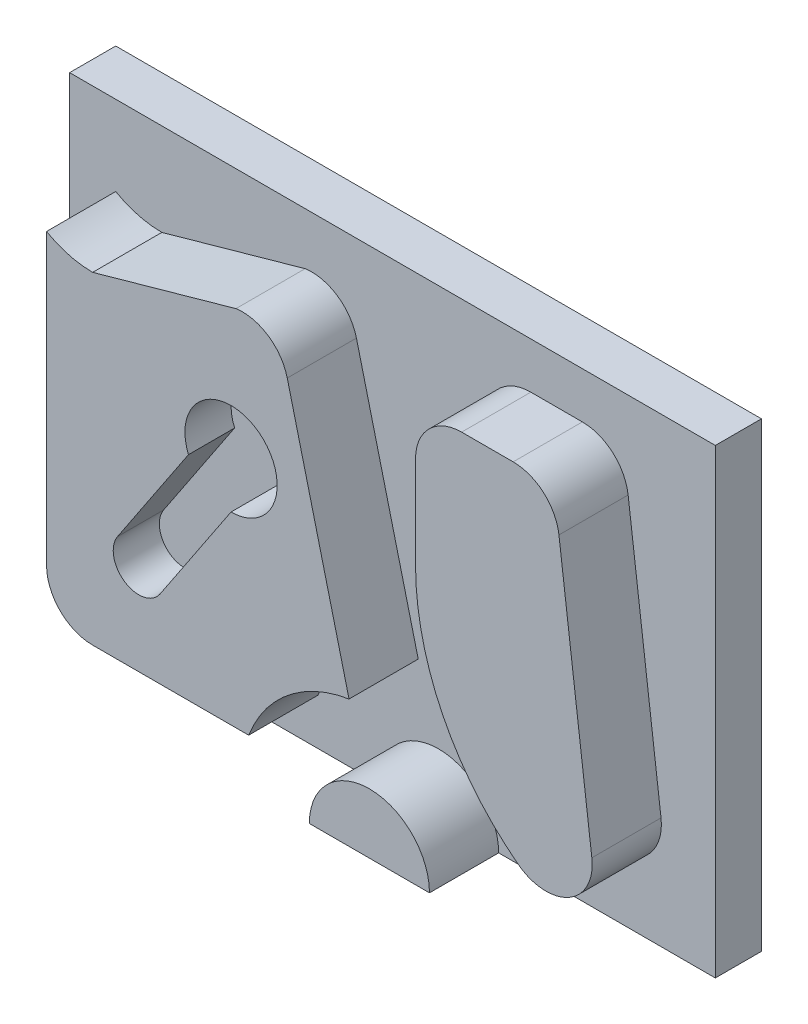
ISO-10303-21;
HEADER;
FILE_DESCRIPTION(('STEP AP214'),'2;1');
FILE_NAME('part.step','',(''),(''),'','','');
FILE_SCHEMA(('AUTOMOTIVE_DESIGN { 1 0 10303 214 1 1 1 1 }'));
ENDSEC;
DATA;
#1=APPLICATION_CONTEXT('core data for automotive mechanical design processes');
#2=APPLICATION_PROTOCOL_DEFINITION('international standard','automotive_design',2000,#1);
#3=PRODUCT_CONTEXT('',#1,'mechanical');
#4=PRODUCT('Part','Part','',(#3));
#5=PRODUCT_RELATED_PRODUCT_CATEGORY('part','',(#4));
#6=PRODUCT_DEFINITION_FORMATION('','',#4);
#7=PRODUCT_DEFINITION_CONTEXT('part definition',#1,'design');
#8=PRODUCT_DEFINITION('design','',#6,#7);
#9=PRODUCT_DEFINITION_SHAPE('','',#8);
#10=(LENGTH_UNIT() NAMED_UNIT(*) SI_UNIT(.MILLI.,.METRE.));
#11=(NAMED_UNIT(*) PLANE_ANGLE_UNIT() SI_UNIT($,.RADIAN.));
#12=(NAMED_UNIT(*) SI_UNIT($,.STERADIAN.) SOLID_ANGLE_UNIT());
#13=UNCERTAINTY_MEASURE_WITH_UNIT(LENGTH_MEASURE(1.E-05),#10,'distance_accuracy_value','');
#14=(GEOMETRIC_REPRESENTATION_CONTEXT(3) GLOBAL_UNCERTAINTY_ASSIGNED_CONTEXT((#13)) GLOBAL_UNIT_ASSIGNED_CONTEXT((#10,
#11,#12)) REPRESENTATION_CONTEXT('',''));
#15=CARTESIAN_POINT('',(0.,0.,0.));
#16=DIRECTION('',(0.,0.,1.));
#17=DIRECTION('',(1.,0.,0.));
#18=AXIS2_PLACEMENT_3D('',#15,#16,#17);
#19=CARTESIAN_POINT('',(170.,30.,12.5));
#20=DIRECTION('',(0.,0.,-1.));
#21=DIRECTION('',(-1.,0.,0.));
#22=AXIS2_PLACEMENT_3D('',#19,#20,#21);
#23=CYLINDRICAL_SURFACE('',#22,10.);
#24=CARTESIAN_POINT('',(170.,30.,10.));
#25=DIRECTION('',(0.,0.,-1.));
#26=DIRECTION('',(1.,0.,0.));
#27=AXIS2_PLACEMENT_3D('',#24,#25,#26);
#28=CIRCLE('',#27,10.);
#29=CARTESIAN_POINT('',(160.,30.,10.));
#30=VERTEX_POINT('',#29);
#31=CARTESIAN_POINT('',(170.,40.,10.));
#32=VERTEX_POINT('',#31);
#33=EDGE_CURVE('E260',#30,#32,#28,.T.);
#34=ORIENTED_EDGE('',*,*,#33,.F.);
#35=DIRECTION('',(0.,0.,1.));
#36=VECTOR('',#35,1.);
#37=CARTESIAN_POINT('',(160.,30.,12.5));
#38=LINE('',#37,#36);
#39=CARTESIAN_POINT('',(160.,30.,25.));
#40=VERTEX_POINT('',#39);
#41=EDGE_CURVE('E59',#30,#40,#38,.T.);
#42=ORIENTED_EDGE('',*,*,#41,.T.);
#43=CARTESIAN_POINT('',(170.,30.,25.));
#44=DIRECTION('',(0.,0.,1.));
#45=DIRECTION('',(-1.,0.,0.));
#46=AXIS2_PLACEMENT_3D('',#43,#44,#45);
#47=CIRCLE('',#46,10.);
#48=CARTESIAN_POINT('',(170.,40.,25.));
#49=VERTEX_POINT('',#48);
#50=EDGE_CURVE('E259',#49,#40,#47,.T.);
#51=ORIENTED_EDGE('',*,*,#50,.F.);
#52=DIRECTION('',(0.,0.,1.));
#53=VECTOR('',#52,1.);
#54=CARTESIAN_POINT('',(170.,40.,12.5));
#55=LINE('',#54,#53);
#56=EDGE_CURVE('E11',#32,#49,#55,.T.);
#57=ORIENTED_EDGE('',*,*,#56,.F.);
#58=EDGE_LOOP('',(#34,#42,#51,#57));
#59=FACE_BOUND('',#58,.T.);
#60=ADVANCED_FACE('F51',(#59),#23,.T.);
#61=CARTESIAN_POINT('',(190.,40.,10.));
#62=DIRECTION('',(0.,1.,0.));
#63=DIRECTION('',(1.,0.,0.));
#64=AXIS2_PLACEMENT_3D('',#61,#62,#63);
#65=PLANE('',#64);
#66=ORIENTED_EDGE('',*,*,#56,.T.);
#67=DIRECTION('',(-1.,0.,0.));
#68=VECTOR('',#67,1.);
#69=CARTESIAN_POINT('',(170.,40.,25.));
#70=LINE('',#69,#68);
#71=CARTESIAN_POINT('',(181.172177815,40.,25.));
#72=VERTEX_POINT('',#71);
#73=EDGE_CURVE('E278',#72,#49,#70,.T.);
#74=ORIENTED_EDGE('',*,*,#73,.F.);
#75=DIRECTION('',(0.,0.,-1.));
#76=VECTOR('',#75,1.);
#77=CARTESIAN_POINT('',(181.172177815,40.,12.5));
#78=LINE('',#77,#76);
#79=CARTESIAN_POINT('',(181.172177815,40.,10.));
#80=VERTEX_POINT('',#79);
#81=EDGE_CURVE('E522',#72,#80,#78,.T.);
#82=ORIENTED_EDGE('',*,*,#81,.T.);
#83=DIRECTION('',(1.,0.,0.));
#84=VECTOR('',#83,1.);
#85=CARTESIAN_POINT('',(175.586088907,40.,10.));
#86=LINE('',#85,#84);
#87=EDGE_CURVE('E526',#32,#80,#86,.T.);
#88=ORIENTED_EDGE('',*,*,#87,.F.);
#89=EDGE_LOOP('',(#66,#74,#82,#88));
#90=FACE_BOUND('',#89,.T.);
#91=ADVANCED_FACE('F539',(#90),#65,.T.);
#92=CARTESIAN_POINT('',(160.,40.,10.));
#93=DIRECTION('',(-1.,0.,0.));
#94=DIRECTION('',(0.,0.,1.));
#95=AXIS2_PLACEMENT_3D('',#92,#93,#94);
#96=PLANE('',#95);
#97=DIRECTION('',(0.,1.,0.));
#98=VECTOR('',#97,1.);
#99=CARTESIAN_POINT('',(160.,20.,10.));
#100=LINE('',#99,#98);
#101=CARTESIAN_POINT('',(160.,10.,10.));
#102=VERTEX_POINT('',#101);
#103=EDGE_CURVE('E529',#102,#30,#100,.T.);
#104=ORIENTED_EDGE('',*,*,#103,.F.);
#105=DIRECTION('',(0.,0.,1.));
#106=VECTOR('',#105,1.);
#107=CARTESIAN_POINT('',(160.,10.,17.5));
#108=LINE('',#107,#106);
#109=CARTESIAN_POINT('',(160.,10.,25.));
#110=VERTEX_POINT('',#109);
#111=EDGE_CURVE('E267',#102,#110,#108,.T.);
#112=ORIENTED_EDGE('',*,*,#111,.T.);
#113=DIRECTION('',(0.,-1.,0.));
#114=VECTOR('',#113,1.);
#115=CARTESIAN_POINT('',(160.,30.,25.));
#116=LINE('',#115,#114);
#117=EDGE_CURVE('E264',#40,#110,#116,.T.);
#118=ORIENTED_EDGE('',*,*,#117,.F.);
#119=ORIENTED_EDGE('',*,*,#41,.F.);
#120=EDGE_LOOP('',(#104,#112,#118,#119));
#121=FACE_BOUND('',#120,.T.);
#122=ADVANCED_FACE('F265',(#121),#96,.T.);
#123=CARTESIAN_POINT('',(140.,0.,10.));
#124=DIRECTION('',(0.,0.,-1.));
#125=DIRECTION('',(0.,-1.,0.));
#126=AXIS2_PLACEMENT_3D('',#123,#124,#125);
#127=PLANE('',#126);
#128=DIRECTION('',(0.,1.,0.));
#129=VECTOR('',#128,1.);
#130=CARTESIAN_POINT('',(80.,1.33974596216,10.));
#131=LINE('',#130,#129);
#132=CARTESIAN_POINT('',(80.,-30.,10.));
#133=VERTEX_POINT('',#132);
#134=CARTESIAN_POINT('',(80.,32.6794919243,10.));
#135=VERTEX_POINT('',#134);
#136=EDGE_CURVE('E352',#133,#135,#131,.T.);
#137=ORIENTED_EDGE('',*,*,#136,.T.);
#138=CARTESIAN_POINT('',(90.,50.,10.));
#139=DIRECTION('',(0.,0.,1.));
#140=DIRECTION('',(1.,0.,0.));
#141=AXIS2_PLACEMENT_3D('',#138,#139,#140);
#142=CIRCLE('',#141,20.);
#143=CARTESIAN_POINT('',(90.,30.,10.));
#144=VERTEX_POINT('',#143);
#145=EDGE_CURVE('E321',#135,#144,#142,.T.);
#146=ORIENTED_EDGE('',*,*,#145,.T.);
#147=DIRECTION('',(0.962767107405164,0.270332197303046,0.));
#148=VECTOR('',#147,1.);
#149=CARTESIAN_POINT('',(105.53588088,34.3622686971,10.));
#150=LINE('',#149,#148);
#151=CARTESIAN_POINT('',(121.071761759,38.7245373942,10.));
#152=VERTEX_POINT('',#151);
#153=EDGE_CURVE('E356',#144,#152,#150,.T.);
#154=ORIENTED_EDGE('',*,*,#153,.T.);
#155=CARTESIAN_POINT('',(122.485975322,28.8250424576,10.));
#156=DIRECTION('',(0.,0.,-1.));
#157=DIRECTION('',(1.,0.,0.));
#158=AXIS2_PLACEMENT_3D('',#155,#156,#157);
#159=CIRCLE('',#158,10.);
#160=CARTESIAN_POINT('',(132.187400323,31.2503987079,10.));
#161=VERTEX_POINT('',#160);
#162=EDGE_CURVE('E313',#152,#161,#159,.T.);
#163=ORIENTED_EDGE('',*,*,#162,.T.);
#164=DIRECTION('',(0.242535625036098,-0.970142500145391,0.));
#165=VECTOR('',#164,1.);
#166=CARTESIAN_POINT('',(138.884493286,4.46202685544,10.));
#167=LINE('',#166,#165);
#168=CARTESIAN_POINT('',(145.581586249,-22.3263449971,10.));
#169=VERTEX_POINT('',#168);
#170=EDGE_CURVE('E307',#161,#169,#167,.T.);
#171=ORIENTED_EDGE('',*,*,#170,.T.);
#172=CARTESIAN_POINT('',(150.,-50.,10.));
#173=DIRECTION('',(0.,0.,1.));
#174=DIRECTION('',(1.,0.,0.));
#175=AXIS2_PLACEMENT_3D('',#172,#173,#174);
#176=CIRCLE('',#175,28.0241603138);
#177=CARTESIAN_POINT('',(123.820741773,-40.,10.));
#178=VERTEX_POINT('',#177);
#179=EDGE_CURVE('E401',#169,#178,#176,.T.);
#180=ORIENTED_EDGE('',*,*,#179,.T.);
#181=DIRECTION('',(-1.,0.,0.));
#182=VECTOR('',#181,1.);
#183=CARTESIAN_POINT('',(106.910370887,-40.,10.));
#184=LINE('',#183,#182);
#185=CARTESIAN_POINT('',(90.,-40.,10.));
#186=VERTEX_POINT('',#185);
#187=EDGE_CURVE('E415',#178,#186,#184,.T.);
#188=ORIENTED_EDGE('',*,*,#187,.T.);
#189=CARTESIAN_POINT('',(90.,-30.,10.));
#190=DIRECTION('',(0.,0.,-1.));
#191=DIRECTION('',(1.,0.,0.));
#192=AXIS2_PLACEMENT_3D('',#189,#190,#191);
#193=CIRCLE('',#192,10.);
#194=EDGE_CURVE('E422',#186,#133,#193,.T.);
#195=ORIENTED_EDGE('',*,*,#194,.T.);
#196=EDGE_LOOP('',(#137,#146,#154,#163,#171,#180,#188,#195));
#197=FACE_BOUND('',#196,.T.);
#198=ORIENTED_EDGE('',*,*,#87,.T.);
#199=CARTESIAN_POINT('',(181.172177815,30.,10.));
#200=DIRECTION('',(0.,0.,-1.));
#201=DIRECTION('',(1.,0.,0.));
#202=AXIS2_PLACEMENT_3D('',#199,#200,#201);
#203=CIRCLE('',#202,10.);
#204=CARTESIAN_POINT('',(191.094956582,31.2403473459,10.));
#205=VERTEX_POINT('',#204);
#206=EDGE_CURVE('E519',#80,#205,#203,.T.);
#207=ORIENTED_EDGE('',*,*,#206,.T.);
#208=DIRECTION('',(0.124034734588962,-0.992277876713698,0.));
#209=VECTOR('',#208,1.);
#210=CARTESIAN_POINT('',(194.661142958,2.71085633757,10.));
#211=LINE('',#210,#209);
#212=CARTESIAN_POINT('',(198.227329334,-25.8186346708,10.));
#213=VERTEX_POINT('',#212);
#214=EDGE_CURVE('E512',#205,#213,#211,.T.);
#215=ORIENTED_EDGE('',*,*,#214,.T.);
#216=CARTESIAN_POINT('',(188.304550567,-27.0589820166,10.));
#217=DIRECTION('',(0.,0.,-1.));
#218=DIRECTION('',(1.,0.,0.));
#219=AXIS2_PLACEMENT_3D('',#216,#217,#218);
#220=CIRCLE('',#219,10.);
#221=CARTESIAN_POINT('',(182.22695426,-35.0001924488,10.));
#222=VERTEX_POINT('',#221);
#223=EDGE_CURVE('E506',#213,#222,#220,.T.);
#224=ORIENTED_EDGE('',*,*,#223,.T.);
#225=CARTESIAN_POINT('',(216.666666667,10.,10.));
#226=DIRECTION('',(0.,0.,-1.));
#227=DIRECTION('',(1.,0.,0.));
#228=AXIS2_PLACEMENT_3D('',#225,#226,#227);
#229=CIRCLE('',#228,56.6666666667);
#230=EDGE_CURVE('E502',#222,#102,#229,.T.);
#231=ORIENTED_EDGE('',*,*,#230,.T.);
#232=ORIENTED_EDGE('',*,*,#103,.T.);
#233=ORIENTED_EDGE('',*,*,#33,.T.);
#234=EDGE_LOOP('',(#198,#207,#215,#224,#231,#232,#233));
#235=FACE_BOUND('',#234,.T.);
#236=CARTESIAN_POINT('',(150.,-50.,10.));
#237=DIRECTION('',(0.,0.,-1.));
#238=DIRECTION('',(1.,0.,0.));
#239=AXIS2_PLACEMENT_3D('',#236,#237,#238);
#240=CIRCLE('',#239,13.0241603138);
#241=CARTESIAN_POINT('',(136.975839686,-50.,10.));
#242=VERTEX_POINT('',#241);
#243=CARTESIAN_POINT('',(163.024160314,-50.,10.));
#244=VERTEX_POINT('',#243);
#245=EDGE_CURVE('E433',#242,#244,#240,.T.);
#246=ORIENTED_EDGE('',*,*,#245,.T.);
#247=DIRECTION('',(-1.,0.,0.));
#248=VECTOR('',#247,1.);
#249=CARTESIAN_POINT('',(186.512080157,-50.,10.));
#250=LINE('',#249,#248);
#251=CARTESIAN_POINT('',(210.,-50.,10.));
#252=VERTEX_POINT('',#251);
#253=EDGE_CURVE('E437',#252,#244,#250,.T.);
#254=ORIENTED_EDGE('',*,*,#253,.F.);
#255=DIRECTION('',(0.,-1.,0.));
#256=VECTOR('',#255,1.);
#257=CARTESIAN_POINT('',(210.,0.,10.));
#258=LINE('',#257,#256);
#259=CARTESIAN_POINT('',(210.,50.,10.));
#260=VERTEX_POINT('',#259);
#261=EDGE_CURVE('E347',#260,#252,#258,.T.);
#262=ORIENTED_EDGE('',*,*,#261,.F.);
#263=DIRECTION('',(1.,0.,0.));
#264=VECTOR('',#263,1.);
#265=CARTESIAN_POINT('',(140.,50.,10.));
#266=LINE('',#265,#264);
#267=CARTESIAN_POINT('',(70.,50.,10.));
#268=VERTEX_POINT('',#267);
#269=EDGE_CURVE('E458',#268,#260,#266,.T.);
#270=ORIENTED_EDGE('',*,*,#269,.F.);
#271=DIRECTION('',(0.,1.,0.));
#272=VECTOR('',#271,1.);
#273=CARTESIAN_POINT('',(70.,0.,10.));
#274=LINE('',#273,#272);
#275=CARTESIAN_POINT('',(70.,-50.,10.));
#276=VERTEX_POINT('',#275);
#277=EDGE_CURVE('E468',#276,#268,#274,.T.);
#278=ORIENTED_EDGE('',*,*,#277,.F.);
#279=DIRECTION('',(-1.,0.,0.));
#280=VECTOR('',#279,1.);
#281=CARTESIAN_POINT('',(103.487919843,-50.,10.));
#282=LINE('',#281,#280);
#283=EDGE_CURVE('E387',#242,#276,#282,.T.);
#284=ORIENTED_EDGE('',*,*,#283,.F.);
#285=EDGE_LOOP('',(#246,#254,#262,#270,#278,#284));
#286=FACE_BOUND('',#285,.T.);
#287=ADVANCED_FACE('F536',(#197,#235,#286),#127,.F.);
#288=CARTESIAN_POINT('',(181.172177815,30.,12.5));
#289=DIRECTION('',(0.,0.,-1.));
#290=DIRECTION('',(0.,1.,0.));
#291=AXIS2_PLACEMENT_3D('',#288,#289,#290);
#292=CYLINDRICAL_SURFACE('',#291,10.);
#293=ORIENTED_EDGE('',*,*,#206,.F.);
#294=ORIENTED_EDGE('',*,*,#81,.F.);
#295=CARTESIAN_POINT('',(181.172177815,30.0000000001537,25.));
#296=DIRECTION('',(0.,0.,1.));
#297=DIRECTION('',(-1.,0.,0.));
#298=AXIS2_PLACEMENT_3D('',#295,#296,#297);
#299=CIRCLE('',#298,9.99999999984628);
#300=CARTESIAN_POINT('',(191.094956582,31.2403473459,25.));
#301=VERTEX_POINT('',#300);
#302=EDGE_CURVE('E292',#301,#72,#299,.T.);
#303=ORIENTED_EDGE('',*,*,#302,.F.);
#304=DIRECTION('',(0.,0.,-1.));
#305=VECTOR('',#304,1.);
#306=CARTESIAN_POINT('',(191.094956582,31.2403473459,12.5));
#307=LINE('',#306,#305);
#308=EDGE_CURVE('E515',#301,#205,#307,.T.);
#309=ORIENTED_EDGE('',*,*,#308,.T.);
#310=EDGE_LOOP('',(#293,#294,#303,#309));
#311=FACE_BOUND('',#310,.T.);
#312=ADVANCED_FACE('F543',(#311),#292,.T.);
#313=CARTESIAN_POINT('',(200.,-40.,10.));
#314=DIRECTION('',(0.992277876713698,0.124034734588962,0.));
#315=DIRECTION('',(0.,0.,-1.));
#316=AXIS2_PLACEMENT_3D('',#313,#314,#315);
#317=PLANE('',#316);
#318=ORIENTED_EDGE('',*,*,#308,.F.);
#319=DIRECTION('',(-0.12403473458771,0.992277876713855,0.));
#320=VECTOR('',#319,1.);
#321=CARTESIAN_POINT('',(191.094956582,31.2403473459,25.));
#322=LINE('',#321,#320);
#323=CARTESIAN_POINT('',(198.227329334,-25.8186346708,25.));
#324=VERTEX_POINT('',#323);
#325=EDGE_CURVE('E288',#324,#301,#322,.T.);
#326=ORIENTED_EDGE('',*,*,#325,.F.);
#327=DIRECTION('',(0.,0.,1.));
#328=VECTOR('',#327,1.);
#329=CARTESIAN_POINT('',(198.227329334,-25.8186346708,17.5115203222));
#330=LINE('',#329,#328);
#331=EDGE_CURVE('E509',#213,#324,#330,.T.);
#332=ORIENTED_EDGE('',*,*,#331,.F.);
#333=ORIENTED_EDGE('',*,*,#214,.F.);
#334=EDGE_LOOP('',(#318,#326,#332,#333));
#335=FACE_BOUND('',#334,.T.);
#336=ADVANCED_FACE('F550',(#335),#317,.T.);
#337=CARTESIAN_POINT('',(188.304550567,-27.0589820166,17.5115203222));
#338=DIRECTION('',(0.,0.,-1.));
#339=DIRECTION('',(0.992277876713698,0.124034734588962,0.));
#340=AXIS2_PLACEMENT_3D('',#337,#338,#339);
#341=CYLINDRICAL_SURFACE('',#340,10.);
#342=ORIENTED_EDGE('',*,*,#223,.F.);
#343=ORIENTED_EDGE('',*,*,#331,.T.);
#344=CARTESIAN_POINT('',(188.304550566965,-27.0589820166641,25.));
#345=DIRECTION('',(0.,0.,1.));
#346=DIRECTION('',(-1.,0.,0.));
#347=AXIS2_PLACEMENT_3D('',#344,#345,#346);
#348=CIRCLE('',#347,9.99999999989519);
#349=CARTESIAN_POINT('',(182.22695426,-35.0001924488,25.));
#350=VERTEX_POINT('',#349);
#351=EDGE_CURVE('E284',#350,#324,#348,.T.);
#352=ORIENTED_EDGE('',*,*,#351,.F.);
#353=DIRECTION('',(0.,0.,1.));
#354=VECTOR('',#353,1.);
#355=CARTESIAN_POINT('',(182.22695426,-35.0001924488,17.5));
#356=LINE('',#355,#354);
#357=EDGE_CURVE('E301',#222,#350,#356,.T.);
#358=ORIENTED_EDGE('',*,*,#357,.F.);
#359=EDGE_LOOP('',(#342,#343,#352,#358));
#360=FACE_BOUND('',#359,.T.);
#361=ADVANCED_FACE('F554',(#360),#341,.T.);
#362=CARTESIAN_POINT('',(216.666666667,10.,17.5));
#363=DIRECTION('',(0.,0.,-1.));
#364=DIRECTION('',(-0.470588235294221,-0.882352941176415,0.));
#365=AXIS2_PLACEMENT_3D('',#362,#363,#364);
#366=CYLINDRICAL_SURFACE('',#365,56.6666666667);
#367=ORIENTED_EDGE('',*,*,#357,.T.);
#368=CARTESIAN_POINT('',(216.666666666238,10.0000000001012,25.));
#369=DIRECTION('',(0.,0.,1.));
#370=DIRECTION('',(-1.,0.,0.));
#371=AXIS2_PLACEMENT_3D('',#368,#369,#370);
#372=CIRCLE('',#371,56.6666666662379);
#373=EDGE_CURVE('E272',#110,#350,#372,.T.);
#374=ORIENTED_EDGE('',*,*,#373,.F.);
#375=ORIENTED_EDGE('',*,*,#111,.F.);
#376=ORIENTED_EDGE('',*,*,#230,.F.);
#377=EDGE_LOOP('',(#367,#374,#375,#376));
#378=FACE_BOUND('',#377,.T.);
#379=ADVANCED_FACE('F556',(#378),#366,.T.);
#380=CARTESIAN_POINT('',(140.,0.,0.));
#381=DIRECTION('',(0.,0.,-1.));
#382=DIRECTION('',(0.,-1.,0.));
#383=AXIS2_PLACEMENT_3D('',#380,#381,#382);
#384=PLANE('',#383);
#385=DIRECTION('',(0.,-1.,0.));
#386=VECTOR('',#385,1.);
#387=CARTESIAN_POINT('',(210.,0.,0.));
#388=LINE('',#387,#386);
#389=CARTESIAN_POINT('',(210.,50.,0.));
#390=VERTEX_POINT('',#389);
#391=CARTESIAN_POINT('',(210.,-50.,0.));
#392=VERTEX_POINT('',#391);
#393=EDGE_CURVE('E346',#390,#392,#388,.T.);
#394=ORIENTED_EDGE('',*,*,#393,.T.);
#395=DIRECTION('',(-1.,0.,0.));
#396=VECTOR('',#395,1.);
#397=CARTESIAN_POINT('',(140.,-50.,0.));
#398=LINE('',#397,#396);
#399=CARTESIAN_POINT('',(70.,-50.,0.));
#400=VERTEX_POINT('',#399);
#401=EDGE_CURVE('E475',#392,#400,#398,.T.);
#402=ORIENTED_EDGE('',*,*,#401,.T.);
#403=DIRECTION('',(0.,1.,0.));
#404=VECTOR('',#403,1.);
#405=CARTESIAN_POINT('',(70.,0.,0.));
#406=LINE('',#405,#404);
#407=CARTESIAN_POINT('',(70.,50.,0.));
#408=VERTEX_POINT('',#407);
#409=EDGE_CURVE('E388',#400,#408,#406,.T.);
#410=ORIENTED_EDGE('',*,*,#409,.T.);
#411=DIRECTION('',(1.,0.,0.));
#412=VECTOR('',#411,1.);
#413=CARTESIAN_POINT('',(140.,50.,0.));
#414=LINE('',#413,#412);
#415=EDGE_CURVE('E461',#408,#390,#414,.T.);
#416=ORIENTED_EDGE('',*,*,#415,.T.);
#417=EDGE_LOOP('',(#394,#402,#410,#416));
#418=FACE_BOUND('',#417,.T.);
#419=ADVANCED_FACE('F558',(#418),#384,.T.);
#420=CARTESIAN_POINT('',(140.,0.,25.));
#421=DIRECTION('',(0.,0.,-1.));
#422=DIRECTION('',(0.,-1.,0.));
#423=AXIS2_PLACEMENT_3D('',#420,#421,#422);
#424=PLANE('',#423);
#425=DIRECTION('',(-0.554700196224998,-0.832050294337998,0.));
#426=VECTOR('',#425,1.);
#427=CARTESIAN_POINT('',(112.307692308,-11.5384615385,25.));
#428=LINE('',#427,#426);
#429=CARTESIAN_POINT('',(120.,0.,25.));
#430=VERTEX_POINT('',#429);
#431=CARTESIAN_POINT('',(104.615384615,-23.0769230769,25.));
#432=VERTEX_POINT('',#431);
#433=EDGE_CURVE('E485',#430,#432,#428,.T.);
#434=ORIENTED_EDGE('',*,*,#433,.T.);
#435=CARTESIAN_POINT('',(100.,-20.,25.));
#436=DIRECTION('',(0.,0.,-1.));
#437=DIRECTION('',(1.,0.,0.));
#438=AXIS2_PLACEMENT_3D('',#435,#436,#437);
#439=CIRCLE('',#438,5.54700196225);
#440=CARTESIAN_POINT('',(95.3846153846,-16.9230769231,25.));
#441=VERTEX_POINT('',#440);
#442=EDGE_CURVE('E368',#432,#441,#439,.T.);
#443=ORIENTED_EDGE('',*,*,#442,.T.);
#444=DIRECTION('',(0.554700196224998,0.832050294337998,0.));
#445=VECTOR('',#444,1.);
#446=CARTESIAN_POINT('',(103.076923077,-5.38461538462,25.));
#447=LINE('',#446,#445);
#448=CARTESIAN_POINT('',(110.769230769,6.15384615385,25.));
#449=VERTEX_POINT('',#448);
#450=EDGE_CURVE('E376',#441,#449,#447,.T.);
#451=ORIENTED_EDGE('',*,*,#450,.T.);
#452=CARTESIAN_POINT('',(120.,10.,25.));
#453=DIRECTION('',(0.,0.,-1.));
#454=DIRECTION('',(1.,0.,0.));
#455=AXIS2_PLACEMENT_3D('',#452,#453,#454);
#456=CIRCLE('',#455,10.);
#457=EDGE_CURVE('E298',#449,#430,#456,.T.);
#458=ORIENTED_EDGE('',*,*,#457,.T.);
#459=EDGE_LOOP('',(#434,#443,#451,#458));
#460=FACE_BOUND('',#459,.T.);
#461=DIRECTION('',(0.,1.,0.));
#462=VECTOR('',#461,1.);
#463=CARTESIAN_POINT('',(80.,1.33974596216,25.));
#464=LINE('',#463,#462);
#465=CARTESIAN_POINT('',(80.,-30.,25.));
#466=VERTEX_POINT('',#465);
#467=CARTESIAN_POINT('',(80.,32.6794919243,25.));
#468=VERTEX_POINT('',#467);
#469=EDGE_CURVE('E360',#466,#468,#464,.T.);
#470=ORIENTED_EDGE('',*,*,#469,.F.);
#471=CARTESIAN_POINT('',(90.,-30.,25.));
#472=DIRECTION('',(0.,0.,-1.));
#473=DIRECTION('',(1.,0.,0.));
#474=AXIS2_PLACEMENT_3D('',#471,#472,#473);
#475=CIRCLE('',#474,10.);
#476=CARTESIAN_POINT('',(90.,-40.,25.));
#477=VERTEX_POINT('',#476);
#478=EDGE_CURVE('E419',#477,#466,#475,.T.);
#479=ORIENTED_EDGE('',*,*,#478,.F.);
#480=DIRECTION('',(-1.,0.,0.));
#481=VECTOR('',#480,1.);
#482=CARTESIAN_POINT('',(106.910370887,-40.,25.));
#483=LINE('',#482,#481);
#484=CARTESIAN_POINT('',(123.820741773,-40.,25.));
#485=VERTEX_POINT('',#484);
#486=EDGE_CURVE('E405',#485,#477,#483,.T.);
#487=ORIENTED_EDGE('',*,*,#486,.F.);
#488=CARTESIAN_POINT('',(150.,-50.,25.));
#489=DIRECTION('',(0.,0.,1.));
#490=DIRECTION('',(1.,0.,0.));
#491=AXIS2_PLACEMENT_3D('',#488,#489,#490);
#492=CIRCLE('',#491,28.0241603138);
#493=CARTESIAN_POINT('',(145.581586249,-22.3263449971,25.));
#494=VERTEX_POINT('',#493);
#495=EDGE_CURVE('E325',#494,#485,#492,.T.);
#496=ORIENTED_EDGE('',*,*,#495,.F.);
#497=DIRECTION('',(0.242535625036098,-0.970142500145391,0.));
#498=VECTOR('',#497,1.);
#499=CARTESIAN_POINT('',(138.884493286,4.46202685544,25.));
#500=LINE('',#499,#498);
#501=CARTESIAN_POINT('',(132.187400323,31.2503987079,25.));
#502=VERTEX_POINT('',#501);
#503=EDGE_CURVE('E308',#502,#494,#500,.T.);
#504=ORIENTED_EDGE('',*,*,#503,.F.);
#505=CARTESIAN_POINT('',(122.485975322,28.8250424576,25.));
#506=DIRECTION('',(0.,0.,-1.));
#507=DIRECTION('',(1.,0.,0.));
#508=AXIS2_PLACEMENT_3D('',#505,#506,#507);
#509=CIRCLE('',#508,10.);
#510=CARTESIAN_POINT('',(121.071761759,38.7245373942,25.));
#511=VERTEX_POINT('',#510);
#512=EDGE_CURVE('E337',#511,#502,#509,.T.);
#513=ORIENTED_EDGE('',*,*,#512,.F.);
#514=DIRECTION('',(0.962767107405164,0.270332197303046,0.));
#515=VECTOR('',#514,1.);
#516=CARTESIAN_POINT('',(105.53588088,34.3622686971,25.));
#517=LINE('',#516,#515);
#518=CARTESIAN_POINT('',(90.,30.,25.));
#519=VERTEX_POINT('',#518);
#520=EDGE_CURVE('E330',#519,#511,#517,.T.);
#521=ORIENTED_EDGE('',*,*,#520,.F.);
#522=CARTESIAN_POINT('',(90.,50.,25.));
#523=DIRECTION('',(0.,0.,1.));
#524=DIRECTION('',(1.,0.,0.));
#525=AXIS2_PLACEMENT_3D('',#522,#523,#524);
#526=CIRCLE('',#525,20.);
#527=EDGE_CURVE('E297',#468,#519,#526,.T.);
#528=ORIENTED_EDGE('',*,*,#527,.F.);
#529=EDGE_LOOP('',(#470,#479,#487,#496,#504,#513,#521,#528));
#530=FACE_BOUND('',#529,.T.);
#531=ADVANCED_FACE('F565',(#460,#530),#424,.F.);
#532=CARTESIAN_POINT('',(120.,10.,20.));
#533=DIRECTION('',(0.,0.,-1.));
#534=DIRECTION('',(-0.923076923077071,-0.38461538461503,0.));
#535=AXIS2_PLACEMENT_3D('',#532,#533,#534);
#536=CYLINDRICAL_SURFACE('',#535,10.);
#537=CARTESIAN_POINT('',(120.,10.,15.));
#538=DIRECTION('',(0.,0.,-1.));
#539=DIRECTION('',(1.,0.,0.));
#540=AXIS2_PLACEMENT_3D('',#537,#538,#539);
#541=CIRCLE('',#540,10.);
#542=CARTESIAN_POINT('',(110.769230769,6.15384615385,15.));
#543=VERTEX_POINT('',#542);
#544=CARTESIAN_POINT('',(120.,0.,15.));
#545=VERTEX_POINT('',#544);
#546=EDGE_CURVE('E302',#543,#545,#541,.T.);
#547=ORIENTED_EDGE('',*,*,#546,.T.);
#548=DIRECTION('',(0.,0.,-1.));
#549=VECTOR('',#548,1.);
#550=CARTESIAN_POINT('',(120.,0.,20.));
#551=LINE('',#550,#549);
#552=EDGE_CURVE('E488',#430,#545,#551,.T.);
#553=ORIENTED_EDGE('',*,*,#552,.F.);
#554=ORIENTED_EDGE('',*,*,#457,.F.);
#555=DIRECTION('',(0.,0.,-1.));
#556=VECTOR('',#555,1.);
#557=CARTESIAN_POINT('',(110.769230769,6.15384615385,20.));
#558=LINE('',#557,#556);
#559=EDGE_CURVE('E372',#449,#543,#558,.T.);
#560=ORIENTED_EDGE('',*,*,#559,.T.);
#561=EDGE_LOOP('',(#547,#553,#554,#560));
#562=FACE_BOUND('',#561,.T.);
#563=ADVANCED_FACE('F639',(#562),#536,.F.);
#564=CARTESIAN_POINT('',(140.,0.,15.));
#565=DIRECTION('',(0.,0.,-1.));
#566=DIRECTION('',(0.,-1.,0.));
#567=AXIS2_PLACEMENT_3D('',#564,#565,#566);
#568=PLANE('',#567);
#569=DIRECTION('',(-0.554700196224998,-0.832050294337998,0.));
#570=VECTOR('',#569,1.);
#571=CARTESIAN_POINT('',(112.307692308,-11.5384615385,15.));
#572=LINE('',#571,#570);
#573=CARTESIAN_POINT('',(104.615384615,-23.0769230769,15.));
#574=VERTEX_POINT('',#573);
#575=EDGE_CURVE('E397',#545,#574,#572,.T.);
#576=ORIENTED_EDGE('',*,*,#575,.F.);
#577=ORIENTED_EDGE('',*,*,#546,.F.);
#578=DIRECTION('',(0.554700196224998,0.832050294337998,0.));
#579=VECTOR('',#578,1.);
#580=CARTESIAN_POINT('',(103.076923077,-5.38461538462,15.));
#581=LINE('',#580,#579);
#582=CARTESIAN_POINT('',(95.3846153846,-16.9230769231,15.));
#583=VERTEX_POINT('',#582);
#584=EDGE_CURVE('E377',#583,#543,#581,.T.);
#585=ORIENTED_EDGE('',*,*,#584,.F.);
#586=CARTESIAN_POINT('',(100.,-20.,15.));
#587=DIRECTION('',(0.,0.,-1.));
#588=DIRECTION('',(1.,0.,0.));
#589=AXIS2_PLACEMENT_3D('',#586,#587,#588);
#590=CIRCLE('',#589,5.54700196225);
#591=EDGE_CURVE('E369',#574,#583,#590,.T.);
#592=ORIENTED_EDGE('',*,*,#591,.F.);
#593=EDGE_LOOP('',(#576,#577,#585,#592));
#594=FACE_BOUND('',#593,.T.);
#595=ADVANCED_FACE('F642',(#594),#568,.F.);
#596=CARTESIAN_POINT('',(110.769230769,6.15384615385,25.));
#597=DIRECTION('',(0.832050294337998,-0.554700196224998,0.));
#598=DIRECTION('',(0.,0.,-1.));
#599=AXIS2_PLACEMENT_3D('',#596,#597,#598);
#600=PLANE('',#599);
#601=ORIENTED_EDGE('',*,*,#584,.T.);
#602=ORIENTED_EDGE('',*,*,#559,.F.);
#603=ORIENTED_EDGE('',*,*,#450,.F.);
#604=DIRECTION('',(0.,0.,-1.));
#605=VECTOR('',#604,1.);
#606=CARTESIAN_POINT('',(95.3846153846,-16.9230769231,20.));
#607=LINE('',#606,#605);
#608=EDGE_CURVE('E364',#441,#583,#607,.T.);
#609=ORIENTED_EDGE('',*,*,#608,.T.);
#610=EDGE_LOOP('',(#601,#602,#603,#609));
#611=FACE_BOUND('',#610,.T.);
#612=ADVANCED_FACE('F614',(#611),#600,.T.);
#613=CARTESIAN_POINT('',(104.615384615,-23.0769230769,25.));
#614=DIRECTION('',(-0.832050294337998,0.554700196224998,0.));
#615=DIRECTION('',(0.,0.,1.));
#616=AXIS2_PLACEMENT_3D('',#613,#614,#615);
#617=PLANE('',#616);
#618=ORIENTED_EDGE('',*,*,#575,.T.);
#619=DIRECTION('',(0.,0.,-1.));
#620=VECTOR('',#619,1.);
#621=CARTESIAN_POINT('',(104.615384615,-23.0769230769,20.));
#622=LINE('',#621,#620);
#623=EDGE_CURVE('E393',#432,#574,#622,.T.);
#624=ORIENTED_EDGE('',*,*,#623,.F.);
#625=ORIENTED_EDGE('',*,*,#433,.F.);
#626=ORIENTED_EDGE('',*,*,#552,.T.);
#627=EDGE_LOOP('',(#618,#624,#625,#626));
#628=FACE_BOUND('',#627,.T.);
#629=ADVANCED_FACE('F610',(#628),#617,.T.);
#630=CARTESIAN_POINT('',(100.,-20.,20.));
#631=DIRECTION('',(0.,0.,-1.));
#632=DIRECTION('',(0.832050294337998,-0.554700196224998,0.));
#633=AXIS2_PLACEMENT_3D('',#630,#631,#632);
#634=CYLINDRICAL_SURFACE('',#633,5.54700196225);
#635=ORIENTED_EDGE('',*,*,#591,.T.);
#636=ORIENTED_EDGE('',*,*,#608,.F.);
#637=ORIENTED_EDGE('',*,*,#442,.F.);
#638=ORIENTED_EDGE('',*,*,#623,.T.);
#639=EDGE_LOOP('',(#635,#636,#637,#638));
#640=FACE_BOUND('',#639,.T.);
#641=ADVANCED_FACE('F613',(#640),#634,.F.);
#642=CARTESIAN_POINT('',(70.,-50.,0.));
#643=DIRECTION('',(0.,-1.,0.));
#644=DIRECTION('',(0.,0.,-1.));
#645=AXIS2_PLACEMENT_3D('',#642,#643,#644);
#646=PLANE('',#645);
#647=DIRECTION('',(-1.,0.,0.));
#648=VECTOR('',#647,1.);
#649=CARTESIAN_POINT('',(150.,-50.,25.));
#650=LINE('',#649,#648);
#651=CARTESIAN_POINT('',(163.024160314,-50.,25.));
#652=VERTEX_POINT('',#651);
#653=CARTESIAN_POINT('',(136.975839686,-50.,25.));
#654=VERTEX_POINT('',#653);
#655=EDGE_CURVE('E445',#652,#654,#650,.T.);
#656=ORIENTED_EDGE('',*,*,#655,.T.);
#657=DIRECTION('',(0.,0.,1.));
#658=VECTOR('',#657,1.);
#659=CARTESIAN_POINT('',(136.975839686,-50.,17.5));
#660=LINE('',#659,#658);
#661=EDGE_CURVE('E441',#242,#654,#660,.T.);
#662=ORIENTED_EDGE('',*,*,#661,.F.);
#663=ORIENTED_EDGE('',*,*,#283,.T.);
#664=DIRECTION('',(0.,0.,1.));
#665=VECTOR('',#664,1.);
#666=CARTESIAN_POINT('',(70.,-50.,5.));
#667=LINE('',#666,#665);
#668=EDGE_CURVE('E383',#400,#276,#667,.T.);
#669=ORIENTED_EDGE('',*,*,#668,.F.);
#670=ORIENTED_EDGE('',*,*,#401,.F.);
#671=DIRECTION('',(0.,0.,1.));
#672=VECTOR('',#671,1.);
#673=CARTESIAN_POINT('',(210.,-50.,5.));
#674=LINE('',#673,#672);
#675=EDGE_CURVE('E342',#392,#252,#674,.T.);
#676=ORIENTED_EDGE('',*,*,#675,.T.);
#677=ORIENTED_EDGE('',*,*,#253,.T.);
#678=DIRECTION('',(0.,0.,1.));
#679=VECTOR('',#678,1.);
#680=CARTESIAN_POINT('',(163.024160314,-50.,17.5));
#681=LINE('',#680,#679);
#682=EDGE_CURVE('E429',#244,#652,#681,.T.);
#683=ORIENTED_EDGE('',*,*,#682,.T.);
#684=EDGE_LOOP('',(#656,#662,#663,#669,#670,#676,#677,#683));
#685=FACE_BOUND('',#684,.T.);
#686=ADVANCED_FACE('F600',(#685),#646,.T.);
#687=CARTESIAN_POINT('',(70.,-50.,0.));
#688=DIRECTION('',(1.,0.,0.));
#689=DIRECTION('',(0.,1.,0.));
#690=AXIS2_PLACEMENT_3D('',#687,#688,#689);
#691=PLANE('',#690);
#692=ORIENTED_EDGE('',*,*,#277,.T.);
#693=DIRECTION('',(0.,0.,1.));
#694=VECTOR('',#693,1.);
#695=CARTESIAN_POINT('',(70.,50.,5.));
#696=LINE('',#695,#694);
#697=EDGE_CURVE('E464',#408,#268,#696,.T.);
#698=ORIENTED_EDGE('',*,*,#697,.F.);
#699=ORIENTED_EDGE('',*,*,#409,.F.);
#700=ORIENTED_EDGE('',*,*,#668,.T.);
#701=EDGE_LOOP('',(#692,#698,#699,#700));
#702=FACE_BOUND('',#701,.T.);
#703=ADVANCED_FACE('F630',(#702),#691,.F.);
#704=CARTESIAN_POINT('',(210.,50.,0.));
#705=DIRECTION('',(0.,1.,0.));
#706=DIRECTION('',(1.,0.,0.));
#707=AXIS2_PLACEMENT_3D('',#704,#705,#706);
#708=PLANE('',#707);
#709=ORIENTED_EDGE('',*,*,#269,.T.);
#710=DIRECTION('',(0.,0.,1.));
#711=VECTOR('',#710,1.);
#712=CARTESIAN_POINT('',(210.,50.,5.));
#713=LINE('',#712,#711);
#714=EDGE_CURVE('E454',#390,#260,#713,.T.);
#715=ORIENTED_EDGE('',*,*,#714,.F.);
#716=ORIENTED_EDGE('',*,*,#415,.F.);
#717=ORIENTED_EDGE('',*,*,#697,.T.);
#718=EDGE_LOOP('',(#709,#715,#716,#717));
#719=FACE_BOUND('',#718,.T.);
#720=ADVANCED_FACE('F633',(#719),#708,.T.);
#721=CARTESIAN_POINT('',(210.,50.,0.));
#722=DIRECTION('',(-1.,0.,0.));
#723=DIRECTION('',(0.,0.,1.));
#724=AXIS2_PLACEMENT_3D('',#721,#722,#723);
#725=PLANE('',#724);
#726=ORIENTED_EDGE('',*,*,#261,.T.);
#727=ORIENTED_EDGE('',*,*,#675,.F.);
#728=ORIENTED_EDGE('',*,*,#393,.F.);
#729=ORIENTED_EDGE('',*,*,#714,.T.);
#730=EDGE_LOOP('',(#726,#727,#728,#729));
#731=FACE_BOUND('',#730,.T.);
#732=ADVANCED_FACE('F653',(#731),#725,.F.);
#733=CARTESIAN_POINT('',(140.,0.,25.));
#734=DIRECTION('',(0.,0.,-1.));
#735=DIRECTION('',(0.,-1.,0.));
#736=AXIS2_PLACEMENT_3D('',#733,#734,#735);
#737=PLANE('',#736);
#738=CARTESIAN_POINT('',(150.,-50.,25.));
#739=DIRECTION('',(0.,0.,-1.));
#740=DIRECTION('',(1.,0.,0.));
#741=AXIS2_PLACEMENT_3D('',#738,#739,#740);
#742=CIRCLE('',#741,13.0241603138);
#743=EDGE_CURVE('E425',#654,#652,#742,.T.);
#744=ORIENTED_EDGE('',*,*,#743,.F.);
#745=ORIENTED_EDGE('',*,*,#655,.F.);
#746=EDGE_LOOP('',(#744,#745));
#747=FACE_BOUND('',#746,.T.);
#748=ADVANCED_FACE('F646',(#747),#737,.F.);
#749=CARTESIAN_POINT('',(150.,-50.,17.5));
#750=DIRECTION('',(0.,0.,-1.));
#751=DIRECTION('',(-1.,0.,0.));
#752=AXIS2_PLACEMENT_3D('',#749,#750,#751);
#753=CYLINDRICAL_SURFACE('',#752,13.0241603138);
#754=ORIENTED_EDGE('',*,*,#743,.T.);
#755=ORIENTED_EDGE('',*,*,#682,.F.);
#756=ORIENTED_EDGE('',*,*,#245,.F.);
#757=ORIENTED_EDGE('',*,*,#661,.T.);
#758=EDGE_LOOP('',(#754,#755,#756,#757));
#759=FACE_BOUND('',#758,.T.);
#760=ADVANCED_FACE('F637',(#759),#753,.T.);
#761=CARTESIAN_POINT('',(90.,-30.,17.5));
#762=DIRECTION('',(0.,0.,-1.));
#763=DIRECTION('',(0.,-1.,0.));
#764=AXIS2_PLACEMENT_3D('',#761,#762,#763);
#765=CYLINDRICAL_SURFACE('',#764,10.);
#766=ORIENTED_EDGE('',*,*,#478,.T.);
#767=DIRECTION('',(0.,0.,1.));
#768=VECTOR('',#767,1.);
#769=CARTESIAN_POINT('',(80.,-30.,17.5));
#770=LINE('',#769,#768);
#771=EDGE_CURVE('E348',#133,#466,#770,.T.);
#772=ORIENTED_EDGE('',*,*,#771,.F.);
#773=ORIENTED_EDGE('',*,*,#194,.F.);
#774=DIRECTION('',(0.,0.,1.));
#775=VECTOR('',#774,1.);
#776=CARTESIAN_POINT('',(90.,-40.,17.5));
#777=LINE('',#776,#775);
#778=EDGE_CURVE('E411',#186,#477,#777,.T.);
#779=ORIENTED_EDGE('',*,*,#778,.T.);
#780=EDGE_LOOP('',(#766,#772,#773,#779));
#781=FACE_BOUND('',#780,.T.);
#782=ADVANCED_FACE('F628',(#781),#765,.T.);
#783=CARTESIAN_POINT('',(200.,-40.,10.));
#784=DIRECTION('',(0.,1.,0.));
#785=DIRECTION('',(1.,0.,0.));
#786=AXIS2_PLACEMENT_3D('',#783,#784,#785);
#787=PLANE('',#786);
#788=ORIENTED_EDGE('',*,*,#486,.T.);
#789=ORIENTED_EDGE('',*,*,#778,.F.);
#790=ORIENTED_EDGE('',*,*,#187,.F.);
#791=DIRECTION('',(0.,0.,1.));
#792=VECTOR('',#791,1.);
#793=CARTESIAN_POINT('',(123.820741773,-40.,17.5));
#794=LINE('',#793,#792);
#795=EDGE_CURVE('E392',#178,#485,#794,.T.);
#796=ORIENTED_EDGE('',*,*,#795,.T.);
#797=EDGE_LOOP('',(#788,#789,#790,#796));
#798=FACE_BOUND('',#797,.T.);
#799=ADVANCED_FACE('F622',(#798),#787,.F.);
#800=CARTESIAN_POINT('',(150.,-50.,17.5));
#801=DIRECTION('',(0.,0.,-1.));
#802=DIRECTION('',(-0.934167444570488,0.356834955553187,0.));
#803=AXIS2_PLACEMENT_3D('',#800,#801,#802);
#804=CYLINDRICAL_SURFACE('',#803,28.0241603138);
#805=ORIENTED_EDGE('',*,*,#495,.T.);
#806=ORIENTED_EDGE('',*,*,#795,.F.);
#807=ORIENTED_EDGE('',*,*,#179,.F.);
#808=DIRECTION('',(0.,0.,1.));
#809=VECTOR('',#808,1.);
#810=CARTESIAN_POINT('',(145.581586249,-22.3263449971,17.5));
#811=LINE('',#810,#809);
#812=EDGE_CURVE('E303',#169,#494,#811,.T.);
#813=ORIENTED_EDGE('',*,*,#812,.T.);
#814=EDGE_LOOP('',(#805,#806,#807,#813));
#815=FACE_BOUND('',#814,.T.);
#816=ADVANCED_FACE('F618',(#815),#804,.F.);
#817=CARTESIAN_POINT('',(132.187400323,31.2503987079,10.));
#818=DIRECTION('',(-0.970142500145391,-0.242535625036098,0.));
#819=DIRECTION('',(-0.242535625036098,0.970142500145391,0.));
#820=AXIS2_PLACEMENT_3D('',#817,#818,#819);
#821=PLANE('',#820);
#822=ORIENTED_EDGE('',*,*,#503,.T.);
#823=ORIENTED_EDGE('',*,*,#812,.F.);
#824=ORIENTED_EDGE('',*,*,#170,.F.);
#825=DIRECTION('',(0.,0.,1.));
#826=VECTOR('',#825,1.);
#827=CARTESIAN_POINT('',(132.187400323,31.2503987079,17.5));
#828=LINE('',#827,#826);
#829=EDGE_CURVE('E317',#161,#502,#828,.T.);
#830=ORIENTED_EDGE('',*,*,#829,.T.);
#831=EDGE_LOOP('',(#822,#823,#824,#830));
#832=FACE_BOUND('',#831,.T.);
#833=ADVANCED_FACE('F608',(#832),#821,.F.);
#834=CARTESIAN_POINT('',(122.485975322,28.8250424576,17.5));
#835=DIRECTION('',(0.,0.,-1.));
#836=DIRECTION('',(-0.141421356237029,0.989949493661206,0.));
#837=AXIS2_PLACEMENT_3D('',#834,#835,#836);
#838=CYLINDRICAL_SURFACE('',#837,10.);
#839=ORIENTED_EDGE('',*,*,#512,.T.);
#840=ORIENTED_EDGE('',*,*,#829,.F.);
#841=ORIENTED_EDGE('',*,*,#162,.F.);
#842=DIRECTION('',(0.,0.,1.));
#843=VECTOR('',#842,1.);
#844=CARTESIAN_POINT('',(121.071761759,38.7245373942,17.5));
#845=LINE('',#844,#843);
#846=EDGE_CURVE('E341',#152,#511,#845,.T.);
#847=ORIENTED_EDGE('',*,*,#846,.T.);
#848=EDGE_LOOP('',(#839,#840,#841,#847));
#849=FACE_BOUND('',#848,.T.);
#850=ADVANCED_FACE('F604',(#849),#838,.T.);
#851=CARTESIAN_POINT('',(80.,32.6794919243,10.));
#852=DIRECTION('',(-1.,0.,0.));
#853=DIRECTION('',(0.,0.,1.));
#854=AXIS2_PLACEMENT_3D('',#851,#852,#853);
#855=PLANE('',#854);
#856=ORIENTED_EDGE('',*,*,#469,.T.);
#857=DIRECTION('',(0.,0.,1.));
#858=VECTOR('',#857,1.);
#859=CARTESIAN_POINT('',(80.,32.6794919243,17.5));
#860=LINE('',#859,#858);
#861=EDGE_CURVE('E326',#135,#468,#860,.T.);
#862=ORIENTED_EDGE('',*,*,#861,.F.);
#863=ORIENTED_EDGE('',*,*,#136,.F.);
#864=ORIENTED_EDGE('',*,*,#771,.T.);
#865=EDGE_LOOP('',(#856,#862,#863,#864));
#866=FACE_BOUND('',#865,.T.);
#867=ADVANCED_FACE('F596',(#866),#855,.T.);
#868=CARTESIAN_POINT('',(121.071761759,38.7245373942,10.));
#869=DIRECTION('',(-0.270332197303046,0.962767107405164,0.));
#870=DIRECTION('',(0.,0.,1.));
#871=AXIS2_PLACEMENT_3D('',#868,#869,#870);
#872=PLANE('',#871);
#873=ORIENTED_EDGE('',*,*,#520,.T.);
#874=ORIENTED_EDGE('',*,*,#846,.F.);
#875=ORIENTED_EDGE('',*,*,#153,.F.);
#876=DIRECTION('',(0.,0.,1.));
#877=VECTOR('',#876,1.);
#878=CARTESIAN_POINT('',(90.,30.,17.5));
#879=LINE('',#878,#877);
#880=EDGE_CURVE('E312',#144,#519,#879,.T.);
#881=ORIENTED_EDGE('',*,*,#880,.T.);
#882=EDGE_LOOP('',(#873,#874,#875,#881));
#883=FACE_BOUND('',#882,.T.);
#884=ADVANCED_FACE('F588',(#883),#872,.T.);
#885=CARTESIAN_POINT('',(90.,50.,17.5));
#886=DIRECTION('',(0.,0.,-1.));
#887=DIRECTION('',(0.,-1.,0.));
#888=AXIS2_PLACEMENT_3D('',#885,#886,#887);
#889=CYLINDRICAL_SURFACE('',#888,20.);
#890=ORIENTED_EDGE('',*,*,#527,.T.);
#891=ORIENTED_EDGE('',*,*,#880,.F.);
#892=ORIENTED_EDGE('',*,*,#145,.F.);
#893=ORIENTED_EDGE('',*,*,#861,.T.);
#894=EDGE_LOOP('',(#890,#891,#892,#893));
#895=FACE_BOUND('',#894,.T.);
#896=ADVANCED_FACE('F583',(#895),#889,.F.);
#897=CARTESIAN_POINT('',(140.,0.,25.));
#898=DIRECTION('',(0.,0.,-1.));
#899=DIRECTION('',(0.,-1.,0.));
#900=AXIS2_PLACEMENT_3D('',#897,#898,#899);
#901=PLANE('',#900);
#902=ORIENTED_EDGE('',*,*,#50,.T.);
#903=ORIENTED_EDGE('',*,*,#117,.T.);
#904=ORIENTED_EDGE('',*,*,#373,.T.);
#905=ORIENTED_EDGE('',*,*,#351,.T.);
#906=ORIENTED_EDGE('',*,*,#325,.T.);
#907=ORIENTED_EDGE('',*,*,#302,.T.);
#908=ORIENTED_EDGE('',*,*,#73,.T.);
#909=EDGE_LOOP('',(#902,#903,#904,#905,#906,#907,#908));
#910=FACE_BOUND('',#909,.T.);
#911=ADVANCED_FACE('F275',(#910),#901,.F.);
#912=CLOSED_SHELL('',(#60,#91,#122,#287,#312,#336,#361,#379,#419,#531,#563,#595,#612,#629,#641,
#686,#703,#720,#732,#748,#760,#782,#799,#816,#833,#850,#867,#884,#896,#911));
#913=MANIFOLD_SOLID_BREP('B2',#912);
#914=ADVANCED_BREP_SHAPE_REPRESENTATION('',(#18,#913),#14);
#915=SHAPE_DEFINITION_REPRESENTATION(#9,#914);
ENDSEC;
END-ISO-10303-21;
